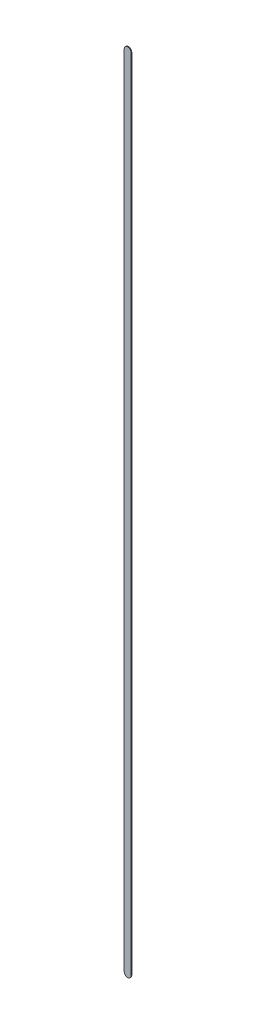
ISO-10303-21;
HEADER;
FILE_DESCRIPTION(('STEP AP214'),'2;1');
FILE_NAME('part.step','',(''),(''),'','','');
FILE_SCHEMA(('AUTOMOTIVE_DESIGN { 1 0 10303 214 1 1 1 1 }'));
ENDSEC;
DATA;
#1=APPLICATION_CONTEXT('core data for automotive mechanical design processes');
#2=APPLICATION_PROTOCOL_DEFINITION('international standard','automotive_design',2000,#1);
#3=PRODUCT_CONTEXT('',#1,'mechanical');
#4=PRODUCT('Part','Part','',(#3));
#5=PRODUCT_RELATED_PRODUCT_CATEGORY('part','',(#4));
#6=PRODUCT_DEFINITION_FORMATION('','',#4);
#7=PRODUCT_DEFINITION_CONTEXT('part definition',#1,'design');
#8=PRODUCT_DEFINITION('design','',#6,#7);
#9=PRODUCT_DEFINITION_SHAPE('','',#8);
#10=(LENGTH_UNIT() NAMED_UNIT(*) SI_UNIT(.MILLI.,.METRE.));
#11=(NAMED_UNIT(*) PLANE_ANGLE_UNIT() SI_UNIT($,.RADIAN.));
#12=(NAMED_UNIT(*) SI_UNIT($,.STERADIAN.) SOLID_ANGLE_UNIT());
#13=UNCERTAINTY_MEASURE_WITH_UNIT(LENGTH_MEASURE(1.E-05),#10,'distance_accuracy_value','');
#14=(GEOMETRIC_REPRESENTATION_CONTEXT(3) GLOBAL_UNCERTAINTY_ASSIGNED_CONTEXT((#13)) GLOBAL_UNIT_ASSIGNED_CONTEXT((#10,
#11,#12)) REPRESENTATION_CONTEXT('',''));
#15=CARTESIAN_POINT('',(0.,0.,0.));
#16=DIRECTION('',(0.,0.,1.));
#17=DIRECTION('',(1.,0.,0.));
#18=AXIS2_PLACEMENT_3D('',#15,#16,#17);
#19=CARTESIAN_POINT('',(24.387498779297,33.227999267578,1.1723000001));
#20=DIRECTION('',(0.,0.,1.));
#21=DIRECTION('',(1.,0.,0.));
#22=AXIS2_PLACEMENT_3D('',#19,#20,#21);
#23=PLANE('',#22);
#24=CARTESIAN_POINT('',(24.387498779297,25.880999755859,1.1723000001));
#25=DIRECTION('',(0.,0.,-1.));
#26=DIRECTION('',(1.,0.,0.));
#27=AXIS2_PLACEMENT_3D('',#24,#25,#26);
#28=CIRCLE('',#27,0.06349975587111);
#29=CARTESIAN_POINT('',(24.450998535156,25.880999145508,1.1723000001));
#30=VERTEX_POINT('',#29);
#31=CARTESIAN_POINT('',(24.323999023438,25.880999145508,1.1723000001));
#32=VERTEX_POINT('',#31);
#33=EDGE_CURVE('E102',#30,#32,#28,.T.);
#34=ORIENTED_EDGE('',*,*,#33,.F.);
#35=DIRECTION('',(0.,1.,0.));
#36=VECTOR('',#35,1.);
#37=CARTESIAN_POINT('',(24.450998535156,40.575,1.1723000001));
#38=LINE('',#37,#36);
#39=CARTESIAN_POINT('',(24.450998535162,40.574998779297,1.1723000001));
#40=VERTEX_POINT('',#39);
#41=EDGE_CURVE('E75',#30,#40,#38,.T.);
#42=ORIENTED_EDGE('',*,*,#41,.T.);
#43=CARTESIAN_POINT('',(24.387498779297,40.574998779297,1.1723000001));
#44=DIRECTION('',(0.,0.,1.));
#45=DIRECTION('',(1.,0.,0.));
#46=AXIS2_PLACEMENT_3D('',#43,#44,#45);
#47=CIRCLE('',#46,0.06349975587111);
#48=CARTESIAN_POINT('',(24.323999023438,40.574999389648,1.1723000001));
#49=VERTEX_POINT('',#48);
#50=EDGE_CURVE('E85',#40,#49,#47,.T.);
#51=ORIENTED_EDGE('',*,*,#50,.T.);
#52=DIRECTION('',(0.,-1.,0.));
#53=VECTOR('',#52,1.);
#54=CARTESIAN_POINT('',(24.323999023438,25.880998535156,1.1723000001));
#55=LINE('',#54,#53);
#56=EDGE_CURVE('E11',#49,#32,#55,.T.);
#57=ORIENTED_EDGE('',*,*,#56,.T.);
#58=EDGE_LOOP('',(#34,#42,#51,#57));
#59=FACE_BOUND('',#58,.T.);
#60=ADVANCED_FACE('F17',(#59),#23,.T.);
#61=CARTESIAN_POINT('',(24.323999023438,25.880998535156,1.1596000001));
#62=DIRECTION('',(1.,0.,0.));
#63=DIRECTION('',(0.,1.,0.));
#64=AXIS2_PLACEMENT_3D('',#61,#62,#63);
#65=PLANE('',#64);
#66=DIRECTION('',(0.,0.,1.));
#67=VECTOR('',#66,1.);
#68=CARTESIAN_POINT('',(24.323999023438,40.575,1.1596000001));
#69=LINE('',#68,#67);
#70=CARTESIAN_POINT('',(24.323999023438,40.574999389648,1.1596000001));
#71=VERTEX_POINT('',#70);
#72=EDGE_CURVE('E83',#71,#49,#69,.T.);
#73=ORIENTED_EDGE('',*,*,#72,.F.);
#74=DIRECTION('',(0.,-1.,0.));
#75=VECTOR('',#74,1.);
#76=CARTESIAN_POINT('',(24.323999023438,33.227999267578,1.1596000001));
#77=LINE('',#76,#75);
#78=CARTESIAN_POINT('',(24.323999023438,25.880999145508,1.1596000001));
#79=VERTEX_POINT('',#78);
#80=EDGE_CURVE('E96',#71,#79,#77,.T.);
#81=ORIENTED_EDGE('',*,*,#80,.T.);
#82=DIRECTION('',(0.,0.,-1.));
#83=VECTOR('',#82,1.);
#84=CARTESIAN_POINT('',(24.323999023438,25.880998535156,1.1596000001));
#85=LINE('',#84,#83);
#86=EDGE_CURVE('E27',#32,#79,#85,.T.);
#87=ORIENTED_EDGE('',*,*,#86,.F.);
#88=ORIENTED_EDGE('',*,*,#56,.F.);
#89=EDGE_LOOP('',(#73,#81,#87,#88));
#90=FACE_BOUND('',#89,.T.);
#91=ADVANCED_FACE('F80',(#90),#65,.F.);
#92=CARTESIAN_POINT('',(24.387498779297,25.880999755859,1.1596000001));
#93=DIRECTION('',(0.,0.,1.));
#94=DIRECTION('',(1.,0.,0.));
#95=AXIS2_PLACEMENT_3D('',#92,#93,#94);
#96=CYLINDRICAL_SURFACE('',#95,0.06349975587111);
#97=CARTESIAN_POINT('',(24.387498779297,25.880999755859,1.1596000001));
#98=DIRECTION('',(0.,0.,1.));
#99=DIRECTION('',(1.,0.,0.));
#100=AXIS2_PLACEMENT_3D('',#97,#98,#99);
#101=CIRCLE('',#100,0.06349975587111);
#102=CARTESIAN_POINT('',(24.450998535156,25.880999145508,1.1596000001));
#103=VERTEX_POINT('',#102);
#104=EDGE_CURVE('E116',#79,#103,#101,.T.);
#105=ORIENTED_EDGE('',*,*,#104,.T.);
#106=DIRECTION('',(0.,0.,1.));
#107=VECTOR('',#106,1.);
#108=CARTESIAN_POINT('',(24.450998535156,25.880998535156,1.1596000001));
#109=LINE('',#108,#107);
#110=EDGE_CURVE('E58',#103,#30,#109,.T.);
#111=ORIENTED_EDGE('',*,*,#110,.T.);
#112=ORIENTED_EDGE('',*,*,#33,.T.);
#113=ORIENTED_EDGE('',*,*,#86,.T.);
#114=EDGE_LOOP('',(#105,#111,#112,#113));
#115=FACE_BOUND('',#114,.T.);
#116=ADVANCED_FACE('F144',(#115),#96,.T.);
#117=CARTESIAN_POINT('',(24.450998535156,40.575,1.1596000001));
#118=DIRECTION('',(-1.,0.,0.));
#119=DIRECTION('',(0.,0.,1.));
#120=AXIS2_PLACEMENT_3D('',#117,#118,#119);
#121=PLANE('',#120);
#122=ORIENTED_EDGE('',*,*,#110,.F.);
#123=DIRECTION('',(0.,1.,0.));
#124=VECTOR('',#123,1.);
#125=CARTESIAN_POINT('',(24.450998535156,33.227999267578,1.1596000001));
#126=LINE('',#125,#124);
#127=CARTESIAN_POINT('',(24.450998535162,40.574998779297,1.1596000001));
#128=VERTEX_POINT('',#127);
#129=EDGE_CURVE('E99',#103,#128,#126,.T.);
#130=ORIENTED_EDGE('',*,*,#129,.T.);
#131=DIRECTION('',(0.,0.,-1.));
#132=VECTOR('',#131,1.);
#133=CARTESIAN_POINT('',(24.450998535168,40.574998779297,1.1596000001));
#134=LINE('',#133,#132);
#135=EDGE_CURVE('E70',#40,#128,#134,.T.);
#136=ORIENTED_EDGE('',*,*,#135,.F.);
#137=ORIENTED_EDGE('',*,*,#41,.F.);
#138=EDGE_LOOP('',(#122,#130,#136,#137));
#139=FACE_BOUND('',#138,.T.);
#140=ADVANCED_FACE('F127',(#139),#121,.F.);
#141=CARTESIAN_POINT('',(24.387498779297,40.574998779297,1.1596000001));
#142=DIRECTION('',(0.,0.,1.));
#143=DIRECTION('',(1.,0.,0.));
#144=AXIS2_PLACEMENT_3D('',#141,#142,#143);
#145=CYLINDRICAL_SURFACE('',#144,0.06349975587111);
#146=CARTESIAN_POINT('',(24.387498779297,40.574998779297,1.1596000001));
#147=DIRECTION('',(0.,0.,1.));
#148=DIRECTION('',(1.,0.,0.));
#149=AXIS2_PLACEMENT_3D('',#146,#147,#148);
#150=CIRCLE('',#149,0.06349975587111);
#151=EDGE_CURVE('E88',#128,#71,#150,.T.);
#152=ORIENTED_EDGE('',*,*,#151,.T.);
#153=ORIENTED_EDGE('',*,*,#72,.T.);
#154=ORIENTED_EDGE('',*,*,#50,.F.);
#155=ORIENTED_EDGE('',*,*,#135,.T.);
#156=EDGE_LOOP('',(#152,#153,#154,#155));
#157=FACE_BOUND('',#156,.T.);
#158=ADVANCED_FACE('F19',(#157),#145,.T.);
#159=CARTESIAN_POINT('',(24.387498779297,33.227999267578,1.1596000001));
#160=DIRECTION('',(0.,0.,1.));
#161=DIRECTION('',(1.,0.,0.));
#162=AXIS2_PLACEMENT_3D('',#159,#160,#161);
#163=PLANE('',#162);
#164=ORIENTED_EDGE('',*,*,#129,.F.);
#165=ORIENTED_EDGE('',*,*,#104,.F.);
#166=ORIENTED_EDGE('',*,*,#80,.F.);
#167=ORIENTED_EDGE('',*,*,#151,.F.);
#168=EDGE_LOOP('',(#164,#165,#166,#167));
#169=FACE_BOUND('',#168,.T.);
#170=ADVANCED_FACE('F129',(#169),#163,.F.);
#171=CLOSED_SHELL('',(#60,#91,#116,#140,#158,#170));
#172=MANIFOLD_SOLID_BREP('B1',#171);
#173=ADVANCED_BREP_SHAPE_REPRESENTATION('',(#18,#172),#14);
#174=SHAPE_DEFINITION_REPRESENTATION(#9,#173);
ENDSEC;
END-ISO-10303-21;
